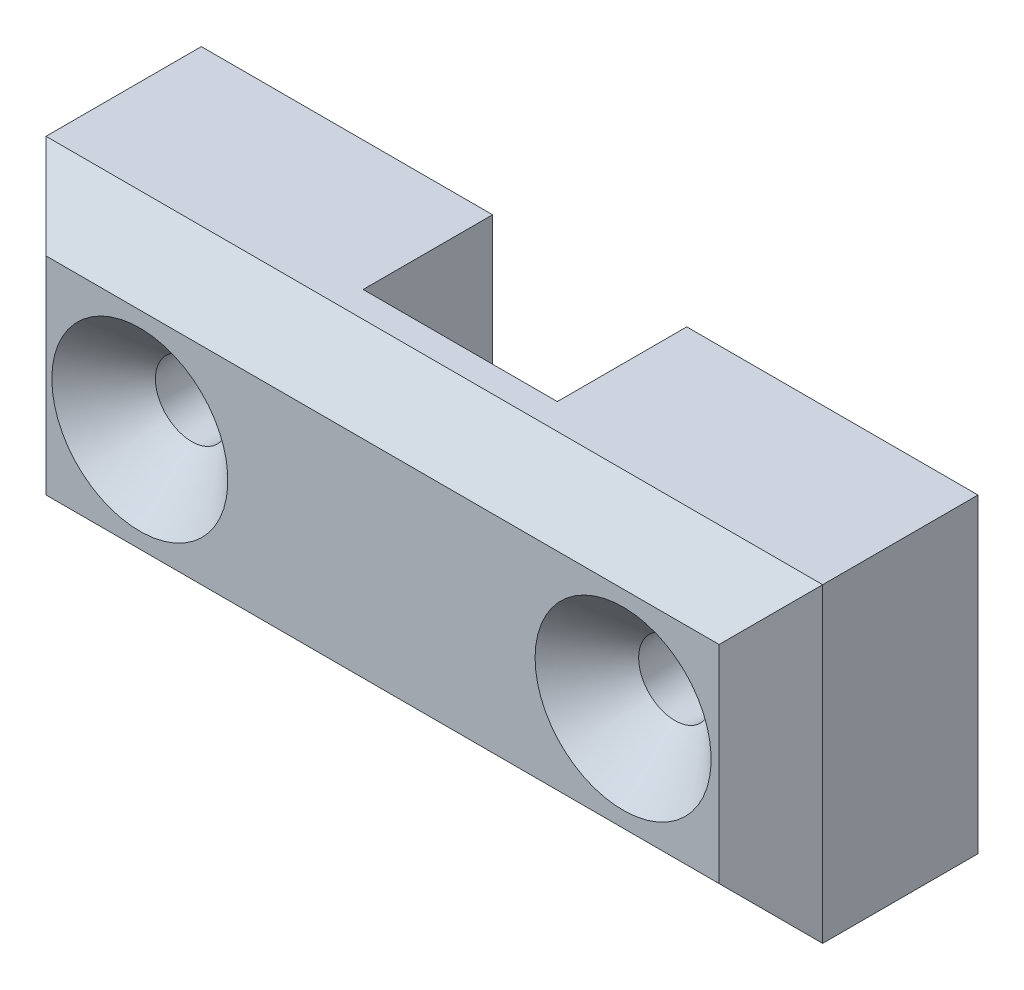
ISO-10303-21;
HEADER;
FILE_DESCRIPTION(('STEP AP214'),'2;1');
FILE_NAME('part.step','',(''),(''),'','','');
FILE_SCHEMA(('AUTOMOTIVE_DESIGN { 1 0 10303 214 1 1 1 1 }'));
ENDSEC;
DATA;
#1=APPLICATION_CONTEXT('core data for automotive mechanical design processes');
#2=APPLICATION_PROTOCOL_DEFINITION('international standard','automotive_design',2000,#1);
#3=PRODUCT_CONTEXT('',#1,'mechanical');
#4=PRODUCT('Part','Part','',(#3));
#5=PRODUCT_RELATED_PRODUCT_CATEGORY('part','',(#4));
#6=PRODUCT_DEFINITION_FORMATION('','',#4);
#7=PRODUCT_DEFINITION_CONTEXT('part definition',#1,'design');
#8=PRODUCT_DEFINITION('design','',#6,#7);
#9=PRODUCT_DEFINITION_SHAPE('','',#8);
#10=(LENGTH_UNIT() NAMED_UNIT(*) SI_UNIT(.MILLI.,.METRE.));
#11=(NAMED_UNIT(*) PLANE_ANGLE_UNIT() SI_UNIT($,.RADIAN.));
#12=(NAMED_UNIT(*) SI_UNIT($,.STERADIAN.) SOLID_ANGLE_UNIT());
#13=UNCERTAINTY_MEASURE_WITH_UNIT(LENGTH_MEASURE(1.E-05),#10,'distance_accuracy_value','');
#14=(GEOMETRIC_REPRESENTATION_CONTEXT(3) GLOBAL_UNCERTAINTY_ASSIGNED_CONTEXT((#13)) GLOBAL_UNIT_ASSIGNED_CONTEXT((#10,
#11,#12)) REPRESENTATION_CONTEXT('',''));
#15=CARTESIAN_POINT('',(0.,0.,0.));
#16=DIRECTION('',(0.,0.,1.));
#17=DIRECTION('',(1.,0.,0.));
#18=AXIS2_PLACEMENT_3D('',#15,#16,#17);
#19=CARTESIAN_POINT('',(0.,0.,60.73181520798));
#20=DIRECTION('',(0.,0.,-1.));
#21=DIRECTION('',(-1.,0.,0.));
#22=AXIS2_PLACEMENT_3D('',#19,#20,#21);
#23=PLANE('',#22);
#24=DIRECTION('',(-1.,0.,0.));
#25=VECTOR('',#24,1.);
#26=CARTESIAN_POINT('',(-3.198147188712,38.101061355301,60.73181520798));
#27=LINE('',#26,#25);
#28=CARTESIAN_POINT('',(-14.448147188712,38.101061355301,60.73181520798));
#29=VERTEX_POINT('',#28);
#30=CARTESIAN_POINT('',(-21.948147188712,38.101061355301,60.73181520798));
#31=VERTEX_POINT('',#30);
#32=EDGE_CURVE('E177',#29,#31,#27,.T.);
#33=ORIENTED_EDGE('',*,*,#32,.T.);
#34=DIRECTION('',(0.,-1.,0.));
#35=VECTOR('',#34,1.);
#36=CARTESIAN_POINT('',(-21.948147188712,50.101061355301,60.73181520798));
#37=LINE('',#36,#35);
#38=CARTESIAN_POINT('',(-21.948147188712,50.101061355301,60.73181520798));
#39=VERTEX_POINT('',#38);
#40=EDGE_CURVE('E157',#39,#31,#37,.T.);
#41=ORIENTED_EDGE('',*,*,#40,.F.);
#42=DIRECTION('',(-1.,0.,0.));
#43=VECTOR('',#42,1.);
#44=CARTESIAN_POINT('',(-3.198147188712,50.101061355301,60.73181520798));
#45=LINE('',#44,#43);
#46=CARTESIAN_POINT('',(-14.448147188712,50.101061355301,60.73181520798));
#47=VERTEX_POINT('',#46);
#48=EDGE_CURVE('E206',#47,#39,#45,.T.);
#49=ORIENTED_EDGE('',*,*,#48,.F.);
#50=DIRECTION('',(0.,1.,0.));
#51=VECTOR('',#50,1.);
#52=CARTESIAN_POINT('',(-14.448147188712,50.101061355301,60.73181520798));
#53=LINE('',#52,#51);
#54=EDGE_CURVE('E161',#29,#47,#53,.T.);
#55=ORIENTED_EDGE('',*,*,#54,.F.);
#56=EDGE_LOOP('',(#33,#41,#49,#55));
#57=FACE_BOUND('',#56,.T.);
#58=ADVANCED_FACE('F53',(#57),#23,.T.);
#59=CARTESIAN_POINT('',(-3.198147188712,50.101061355301,63.73181520798));
#60=DIRECTION('',(1.,0.,0.));
#61=DIRECTION('',(0.,0.,-1.));
#62=AXIS2_PLACEMENT_3D('',#59,#60,#61);
#63=PLANE('',#62);
#64=DIRECTION('',(0.,0.,-1.));
#65=VECTOR('',#64,1.);
#66=CARTESIAN_POINT('',(-3.198147188712,50.101061355301,63.73181520798));
#67=LINE('',#66,#65);
#68=CARTESIAN_POINT('',(-3.198147188712,50.101061355301,61.73181520798));
#69=VERTEX_POINT('',#68);
#70=CARTESIAN_POINT('',(-3.198147188712,50.101061355301,55.73181520798));
#71=VERTEX_POINT('',#70);
#72=EDGE_CURVE('E139',#69,#71,#67,.T.);
#73=ORIENTED_EDGE('',*,*,#72,.F.);
#74=DIRECTION('',(0.,-1.,0.));
#75=VECTOR('',#74,1.);
#76=CARTESIAN_POINT('',(-3.198147188712,38.101061355301,61.73181520798));
#77=LINE('',#76,#75);
#78=CARTESIAN_POINT('',(-3.198147188712,38.101061355301,61.73181520798));
#79=VERTEX_POINT('',#78);
#80=EDGE_CURVE('E245',#69,#79,#77,.T.);
#81=ORIENTED_EDGE('',*,*,#80,.T.);
#82=DIRECTION('',(0.,0.,-1.));
#83=VECTOR('',#82,1.);
#84=CARTESIAN_POINT('',(-3.198147188712,38.101061355301,63.73181520798));
#85=LINE('',#84,#83);
#86=CARTESIAN_POINT('',(-3.198147188712,38.101061355301,55.73181520798));
#87=VERTEX_POINT('',#86);
#88=EDGE_CURVE('E209',#79,#87,#85,.T.);
#89=ORIENTED_EDGE('',*,*,#88,.T.);
#90=DIRECTION('',(0.,-1.,0.));
#91=VECTOR('',#90,1.);
#92=CARTESIAN_POINT('',(-3.198147188712,50.101061355301,55.73181520798));
#93=LINE('',#92,#91);
#94=EDGE_CURVE('E191',#71,#87,#93,.T.);
#95=ORIENTED_EDGE('',*,*,#94,.F.);
#96=EDGE_LOOP('',(#73,#81,#89,#95));
#97=FACE_BOUND('',#96,.T.);
#98=ADVANCED_FACE('F288',(#97),#63,.T.);
#99=CARTESIAN_POINT('',(-3.198147188712,50.101061355301,63.73181520798));
#100=DIRECTION('',(0.,-1.,0.));
#101=DIRECTION('',(0.,0.,-1.));
#102=AXIS2_PLACEMENT_3D('',#99,#100,#101);
#103=PLANE('',#102);
#104=DIRECTION('',(0.,0.,-1.));
#105=VECTOR('',#104,1.);
#106=CARTESIAN_POINT('',(-33.198147188712,50.101061355301,63.73181520798));
#107=LINE('',#106,#105);
#108=CARTESIAN_POINT('',(-33.198147188712,50.101061355301,61.73181520798));
#109=VERTEX_POINT('',#108);
#110=CARTESIAN_POINT('',(-33.198147188712,50.101061355301,55.73181520798));
#111=VERTEX_POINT('',#110);
#112=EDGE_CURVE('E133',#109,#111,#107,.T.);
#113=ORIENTED_EDGE('',*,*,#112,.F.);
#114=DIRECTION('',(1.,0.,0.));
#115=VECTOR('',#114,1.);
#116=CARTESIAN_POINT('',(-3.198147188712,50.101061355301,61.73181520798));
#117=LINE('',#116,#115);
#118=EDGE_CURVE('E72',#109,#69,#117,.T.);
#119=ORIENTED_EDGE('',*,*,#118,.T.);
#120=ORIENTED_EDGE('',*,*,#72,.T.);
#121=DIRECTION('',(1.,0.,0.));
#122=VECTOR('',#121,1.);
#123=CARTESIAN_POINT('',(-3.198147188712,50.101061355301,55.73181520798));
#124=LINE('',#123,#122);
#125=CARTESIAN_POINT('',(-14.448147188712,50.101061355301,55.73181520798));
#126=VERTEX_POINT('',#125);
#127=EDGE_CURVE('E187',#126,#71,#124,.T.);
#128=ORIENTED_EDGE('',*,*,#127,.F.);
#129=DIRECTION('',(0.,0.,1.));
#130=VECTOR('',#129,1.);
#131=CARTESIAN_POINT('',(-14.448147188712,50.101061355301,55.73181520798));
#132=LINE('',#131,#130);
#133=EDGE_CURVE('E182',#126,#47,#132,.T.);
#134=ORIENTED_EDGE('',*,*,#133,.T.);
#135=ORIENTED_EDGE('',*,*,#48,.T.);
#136=DIRECTION('',(0.,0.,1.));
#137=VECTOR('',#136,1.);
#138=CARTESIAN_POINT('',(-21.948147188712,50.101061355301,55.73181520798));
#139=LINE('',#138,#137);
#140=CARTESIAN_POINT('',(-21.948147188712,50.101061355301,55.73181520798));
#141=VERTEX_POINT('',#140);
#142=EDGE_CURVE('E146',#141,#39,#139,.T.);
#143=ORIENTED_EDGE('',*,*,#142,.F.);
#144=DIRECTION('',(1.,0.,0.));
#145=VECTOR('',#144,1.);
#146=CARTESIAN_POINT('',(-33.198147188712,50.101061355301,55.73181520798));
#147=LINE('',#146,#145);
#148=EDGE_CURVE('E143',#111,#141,#147,.T.);
#149=ORIENTED_EDGE('',*,*,#148,.F.);
#150=EDGE_LOOP('',(#113,#119,#120,#128,#134,#135,#143,#149));
#151=FACE_BOUND('',#150,.T.);
#152=ADVANCED_FACE('F144',(#151),#103,.F.);
#153=CARTESIAN_POINT('',(-33.198147188712,50.101061355301,63.73181520798));
#154=DIRECTION('',(1.,0.,0.));
#155=DIRECTION('',(0.,0.,-1.));
#156=AXIS2_PLACEMENT_3D('',#153,#154,#155);
#157=PLANE('',#156);
#158=DIRECTION('',(0.,0.,-1.));
#159=VECTOR('',#158,1.);
#160=CARTESIAN_POINT('',(-33.198147188712,38.101061355301,63.73181520798));
#161=LINE('',#160,#159);
#162=CARTESIAN_POINT('',(-33.198147188712,38.101061355301,61.73181520798));
#163=VERTEX_POINT('',#162);
#164=CARTESIAN_POINT('',(-33.198147188712,38.101061355301,55.73181520798));
#165=VERTEX_POINT('',#164);
#166=EDGE_CURVE('E140',#163,#165,#161,.T.);
#167=ORIENTED_EDGE('',*,*,#166,.F.);
#168=DIRECTION('',(0.,1.,0.));
#169=VECTOR('',#168,1.);
#170=CARTESIAN_POINT('',(-33.198147188712,50.101061355301,61.73181520798));
#171=LINE('',#170,#169);
#172=EDGE_CURVE('E80',#163,#109,#171,.T.);
#173=ORIENTED_EDGE('',*,*,#172,.T.);
#174=ORIENTED_EDGE('',*,*,#112,.T.);
#175=DIRECTION('',(0.,1.,0.));
#176=VECTOR('',#175,1.);
#177=CARTESIAN_POINT('',(-33.198147188712,50.101061355301,55.73181520798));
#178=LINE('',#177,#176);
#179=EDGE_CURVE('E137',#165,#111,#178,.T.);
#180=ORIENTED_EDGE('',*,*,#179,.F.);
#181=EDGE_LOOP('',(#167,#173,#174,#180));
#182=FACE_BOUND('',#181,.T.);
#183=ADVANCED_FACE('F135',(#182),#157,.F.);
#184=CARTESIAN_POINT('',(-3.198147188712,38.101061355301,63.73181520798));
#185=DIRECTION('',(0.,-1.,0.));
#186=DIRECTION('',(0.,0.,-1.));
#187=AXIS2_PLACEMENT_3D('',#184,#185,#186);
#188=PLANE('',#187);
#189=ORIENTED_EDGE('',*,*,#88,.F.);
#190=DIRECTION('',(-1.,0.,0.));
#191=VECTOR('',#190,1.);
#192=CARTESIAN_POINT('',(-33.198147188712,38.101061355301,61.73181520798));
#193=LINE('',#192,#191);
#194=EDGE_CURVE('E211',#79,#163,#193,.T.);
#195=ORIENTED_EDGE('',*,*,#194,.T.);
#196=ORIENTED_EDGE('',*,*,#166,.T.);
#197=DIRECTION('',(-1.,0.,0.));
#198=VECTOR('',#197,1.);
#199=CARTESIAN_POINT('',(-33.198147188712,38.101061355301,55.73181520798));
#200=LINE('',#199,#198);
#201=CARTESIAN_POINT('',(-21.948147188712,38.101061355301,55.73181520798));
#202=VERTEX_POINT('',#201);
#203=EDGE_CURVE('E155',#202,#165,#200,.T.);
#204=ORIENTED_EDGE('',*,*,#203,.F.);
#205=DIRECTION('',(0.,0.,1.));
#206=VECTOR('',#205,1.);
#207=CARTESIAN_POINT('',(-21.948147188712,38.101061355301,55.73181520798));
#208=LINE('',#207,#206);
#209=EDGE_CURVE('E170',#202,#31,#208,.T.);
#210=ORIENTED_EDGE('',*,*,#209,.T.);
#211=ORIENTED_EDGE('',*,*,#32,.F.);
#212=DIRECTION('',(0.,0.,1.));
#213=VECTOR('',#212,1.);
#214=CARTESIAN_POINT('',(-14.448147188712,38.101061355301,55.73181520798));
#215=LINE('',#214,#213);
#216=CARTESIAN_POINT('',(-14.448147188712,38.101061355301,55.73181520798));
#217=VERTEX_POINT('',#216);
#218=EDGE_CURVE('E178',#217,#29,#215,.T.);
#219=ORIENTED_EDGE('',*,*,#218,.F.);
#220=DIRECTION('',(-1.,0.,0.));
#221=VECTOR('',#220,1.);
#222=CARTESIAN_POINT('',(-3.198147188712,38.101061355301,55.73181520798));
#223=LINE('',#222,#221);
#224=EDGE_CURVE('E198',#87,#217,#223,.T.);
#225=ORIENTED_EDGE('',*,*,#224,.F.);
#226=EDGE_LOOP('',(#189,#195,#196,#204,#210,#211,#219,#225));
#227=FACE_BOUND('',#226,.T.);
#228=ADVANCED_FACE('F292',(#227),#188,.T.);
#229=CARTESIAN_POINT('',(0.,0.,63.73181520798));
#230=DIRECTION('',(0.,0.,-1.));
#231=DIRECTION('',(-1.,0.,0.));
#232=AXIS2_PLACEMENT_3D('',#229,#230,#231);
#233=PLANE('',#232);
#234=DIRECTION('',(0.,-1.,0.));
#235=VECTOR('',#234,1.);
#236=CARTESIAN_POINT('',(-31.198147188712,0.,63.73181520798));
#237=LINE('',#236,#235);
#238=CARTESIAN_POINT('',(-31.198147188712,48.101061355301,63.73181520798));
#239=VERTEX_POINT('',#238);
#240=CARTESIAN_POINT('',(-31.198147188712,40.101061355301,63.73181520798));
#241=VERTEX_POINT('',#240);
#242=EDGE_CURVE('E234',#239,#241,#237,.T.);
#243=ORIENTED_EDGE('',*,*,#242,.T.);
#244=DIRECTION('',(1.,0.,0.));
#245=VECTOR('',#244,1.);
#246=CARTESIAN_POINT('',(-3.198147188712,40.101061355301,63.73181520798));
#247=LINE('',#246,#245);
#248=CARTESIAN_POINT('',(-5.198147188712,40.101061355301,63.73181520798));
#249=VERTEX_POINT('',#248);
#250=EDGE_CURVE('E237',#241,#249,#247,.T.);
#251=ORIENTED_EDGE('',*,*,#250,.T.);
#252=DIRECTION('',(0.,1.,0.));
#253=VECTOR('',#252,1.);
#254=CARTESIAN_POINT('',(-5.198147188712,50.101061355301,63.73181520798));
#255=LINE('',#254,#253);
#256=CARTESIAN_POINT('',(-5.198147188712,48.101061355301,63.73181520798));
#257=VERTEX_POINT('',#256);
#258=EDGE_CURVE('E228',#249,#257,#255,.T.);
#259=ORIENTED_EDGE('',*,*,#258,.T.);
#260=DIRECTION('',(-1.,0.,0.));
#261=VECTOR('',#260,1.);
#262=CARTESIAN_POINT('',(0.,48.101061355301,63.73181520798));
#263=LINE('',#262,#261);
#264=EDGE_CURVE('E231',#257,#239,#263,.T.);
#265=ORIENTED_EDGE('',*,*,#264,.T.);
#266=EDGE_LOOP('',(#243,#251,#259,#265));
#267=FACE_BOUND('',#266,.T.);
#268=CARTESIAN_POINT('',(-27.573147188712,44.101061355301,63.73181520798));
#269=DIRECTION('',(0.,0.,-1.));
#270=DIRECTION('',(-1.,0.,0.));
#271=AXIS2_PLACEMENT_3D('',#268,#269,#270);
#272=CIRCLE('',#271,3.4);
#273=CARTESIAN_POINT('',(-30.973147188712,44.101061355301,63.73181520798));
#274=VERTEX_POINT('',#273);
#275=EDGE_CURVE('E224',#274,#274,#272,.T.);
#276=ORIENTED_EDGE('',*,*,#275,.T.);
#277=EDGE_LOOP('',(#276));
#278=FACE_BOUND('',#277,.T.);
#279=CARTESIAN_POINT('',(-8.90678315498321,44.101061355301,63.73181520798));
#280=DIRECTION('',(0.,0.,-1.));
#281=DIRECTION('',(-1.,0.,0.));
#282=AXIS2_PLACEMENT_3D('',#279,#280,#281);
#283=CIRCLE('',#282,3.4);
#284=CARTESIAN_POINT('',(-12.3067831549832,44.101061355301,63.73181520798));
#285=VERTEX_POINT('',#284);
#286=EDGE_CURVE('E220',#285,#285,#283,.T.);
#287=ORIENTED_EDGE('',*,*,#286,.T.);
#288=EDGE_LOOP('',(#287));
#289=FACE_BOUND('',#288,.T.);
#290=ADVANCED_FACE('F330',(#267,#278,#289),#233,.F.);
#291=CARTESIAN_POINT('',(-21.948147188712,50.101061355301,55.73181520798));
#292=DIRECTION('',(-1.,0.,0.));
#293=DIRECTION('',(0.,0.,1.));
#294=AXIS2_PLACEMENT_3D('',#291,#292,#293);
#295=PLANE('',#294);
#296=ORIENTED_EDGE('',*,*,#40,.T.);
#297=ORIENTED_EDGE('',*,*,#209,.F.);
#298=DIRECTION('',(0.,-1.,0.));
#299=VECTOR('',#298,1.);
#300=CARTESIAN_POINT('',(-21.948147188712,50.101061355301,55.73181520798));
#301=LINE('',#300,#299);
#302=EDGE_CURVE('E150',#141,#202,#301,.T.);
#303=ORIENTED_EDGE('',*,*,#302,.F.);
#304=ORIENTED_EDGE('',*,*,#142,.T.);
#305=EDGE_LOOP('',(#296,#297,#303,#304));
#306=FACE_BOUND('',#305,.T.);
#307=ADVANCED_FACE('F301',(#306),#295,.F.);
#308=CARTESIAN_POINT('',(0.,0.,55.73181520798));
#309=DIRECTION('',(0.,0.,1.));
#310=DIRECTION('',(1.,0.,0.));
#311=AXIS2_PLACEMENT_3D('',#308,#309,#310);
#312=PLANE('',#311);
#313=CARTESIAN_POINT('',(-27.573147188712,44.101061355301,55.73181520798));
#314=DIRECTION('',(0.,0.,-1.));
#315=DIRECTION('',(-1.,0.,0.));
#316=AXIS2_PLACEMENT_3D('',#313,#314,#315);
#317=CIRCLE('',#316,1.4);
#318=CARTESIAN_POINT('',(-28.973147188712,44.101061355301,55.73181520798));
#319=VERTEX_POINT('',#318);
#320=EDGE_CURVE('E164',#319,#319,#317,.T.);
#321=ORIENTED_EDGE('',*,*,#320,.F.);
#322=EDGE_LOOP('',(#321));
#323=FACE_BOUND('',#322,.T.);
#324=ORIENTED_EDGE('',*,*,#179,.T.);
#325=ORIENTED_EDGE('',*,*,#148,.T.);
#326=ORIENTED_EDGE('',*,*,#302,.T.);
#327=ORIENTED_EDGE('',*,*,#203,.T.);
#328=EDGE_LOOP('',(#324,#325,#326,#327));
#329=FACE_BOUND('',#328,.T.);
#330=ADVANCED_FACE('F153',(#323,#329),#312,.F.);
#331=CARTESIAN_POINT('',(-14.448147188712,50.101061355301,55.73181520798));
#332=DIRECTION('',(1.,0.,0.));
#333=DIRECTION('',(0.,1.,0.));
#334=AXIS2_PLACEMENT_3D('',#331,#332,#333);
#335=PLANE('',#334);
#336=ORIENTED_EDGE('',*,*,#54,.T.);
#337=ORIENTED_EDGE('',*,*,#133,.F.);
#338=DIRECTION('',(0.,1.,0.));
#339=VECTOR('',#338,1.);
#340=CARTESIAN_POINT('',(-14.448147188712,50.101061355301,55.73181520798));
#341=LINE('',#340,#339);
#342=EDGE_CURVE('E195',#217,#126,#341,.T.);
#343=ORIENTED_EDGE('',*,*,#342,.F.);
#344=ORIENTED_EDGE('',*,*,#218,.T.);
#345=EDGE_LOOP('',(#336,#337,#343,#344));
#346=FACE_BOUND('',#345,.T.);
#347=ADVANCED_FACE('F281',(#346),#335,.F.);
#348=CARTESIAN_POINT('',(0.,0.,55.73181520798));
#349=DIRECTION('',(0.,0.,-1.));
#350=DIRECTION('',(-1.,0.,0.));
#351=AXIS2_PLACEMENT_3D('',#348,#349,#350);
#352=PLANE('',#351);
#353=CARTESIAN_POINT('',(-8.90678315498321,44.101061355301,55.73181520798));
#354=DIRECTION('',(0.,0.,-1.));
#355=DIRECTION('',(-1.,0.,0.));
#356=AXIS2_PLACEMENT_3D('',#353,#354,#355);
#357=CIRCLE('',#356,1.4);
#358=CARTESIAN_POINT('',(-10.3067831549832,44.101061355301,55.73181520798));
#359=VERTEX_POINT('',#358);
#360=EDGE_CURVE('E183',#359,#359,#357,.T.);
#361=ORIENTED_EDGE('',*,*,#360,.F.);
#362=EDGE_LOOP('',(#361));
#363=FACE_BOUND('',#362,.T.);
#364=ORIENTED_EDGE('',*,*,#94,.T.);
#365=ORIENTED_EDGE('',*,*,#224,.T.);
#366=ORIENTED_EDGE('',*,*,#342,.T.);
#367=ORIENTED_EDGE('',*,*,#127,.T.);
#368=EDGE_LOOP('',(#364,#365,#366,#367));
#369=FACE_BOUND('',#368,.T.);
#370=ADVANCED_FACE('F278',(#363,#369),#352,.T.);
#371=CARTESIAN_POINT('',(-8.90678315498321,44.101061355301,65.73181520798));
#372=DIRECTION('',(0.,0.,-1.));
#373=DIRECTION('',(-1.,0.,0.));
#374=AXIS2_PLACEMENT_3D('',#371,#372,#373);
#375=CYLINDRICAL_SURFACE('',#374,1.4);
#376=CARTESIAN_POINT('',(-8.90678315498321,44.101061355301,61.73181520798));
#377=DIRECTION('',(0.,0.,-1.));
#378=DIRECTION('',(-1.,0.,0.));
#379=AXIS2_PLACEMENT_3D('',#376,#377,#378);
#380=CIRCLE('',#379,1.4);
#381=CARTESIAN_POINT('',(-10.3067831549832,44.101061355301,61.73181520798));
#382=VERTEX_POINT('',#381);
#383=EDGE_CURVE('E11',#382,#382,#380,.F.);
#384=ORIENTED_EDGE('',*,*,#383,.T.);
#385=EDGE_LOOP('',(#384));
#386=FACE_BOUND('',#385,.T.);
#387=ORIENTED_EDGE('',*,*,#360,.T.);
#388=EDGE_LOOP('',(#387));
#389=FACE_BOUND('',#388,.T.);
#390=ADVANCED_FACE('F276',(#386,#389),#375,.F.);
#391=CARTESIAN_POINT('',(-27.573147188712,44.101061355301,65.73181520798));
#392=DIRECTION('',(0.,0.,-1.));
#393=DIRECTION('',(-1.,0.,0.));
#394=AXIS2_PLACEMENT_3D('',#391,#392,#393);
#395=CYLINDRICAL_SURFACE('',#394,1.4);
#396=CARTESIAN_POINT('',(-27.573147188712,44.101061355301,61.73181520798));
#397=DIRECTION('',(0.,0.,-1.));
#398=DIRECTION('',(-1.,0.,0.));
#399=AXIS2_PLACEMENT_3D('',#396,#397,#398);
#400=CIRCLE('',#399,1.4);
#401=CARTESIAN_POINT('',(-28.973147188712,44.101061355301,61.73181520798));
#402=VERTEX_POINT('',#401);
#403=EDGE_CURVE('E64',#402,#402,#400,.F.);
#404=ORIENTED_EDGE('',*,*,#403,.T.);
#405=EDGE_LOOP('',(#404));
#406=FACE_BOUND('',#405,.T.);
#407=ORIENTED_EDGE('',*,*,#320,.T.);
#408=EDGE_LOOP('',(#407));
#409=FACE_BOUND('',#408,.T.);
#410=ADVANCED_FACE('F353',(#406,#409),#395,.F.);
#411=CARTESIAN_POINT('',(0.,48.101061355301,63.73181520798));
#412=DIRECTION('',(0.,-0.707106781186544,-0.707106781186551));
#413=DIRECTION('',(-1.,0.,0.));
#414=AXIS2_PLACEMENT_3D('',#411,#412,#413);
#415=PLANE('',#414);
#416=DIRECTION('',(0.577350269189628,-0.577350269189628,0.577350269189622));
#417=VECTOR('',#416,1.);
#418=CARTESIAN_POINT('',(-20.7987647924746,37.7016789590636,74.1311976042173));
#419=LINE('',#418,#417);
#420=EDGE_CURVE('E256',#239,#109,#419,.F.);
#421=ORIENTED_EDGE('',*,*,#420,.F.);
#422=ORIENTED_EDGE('',*,*,#264,.F.);
#423=DIRECTION('',(0.577350269189628,0.577350269189628,-0.577350269189622));
#424=VECTOR('',#423,1.);
#425=CARTESIAN_POINT('',(-3.198147188712,50.101061355301,61.73181520798));
#426=LINE('',#425,#424);
#427=EDGE_CURVE('E58',#69,#257,#426,.F.);
#428=ORIENTED_EDGE('',*,*,#427,.F.);
#429=ORIENTED_EDGE('',*,*,#118,.F.);
#430=EDGE_LOOP('',(#421,#422,#428,#429));
#431=FACE_BOUND('',#430,.T.);
#432=ADVANCED_FACE('F317',(#431),#415,.F.);
#433=CARTESIAN_POINT('',(-3.198147188712,50.101061355301,61.73181520798));
#434=DIRECTION('',(0.707106781186544,0.,0.707106781186551));
#435=DIRECTION('',(0.,1.,0.));
#436=AXIS2_PLACEMENT_3D('',#433,#434,#435);
#437=PLANE('',#436);
#438=ORIENTED_EDGE('',*,*,#427,.T.);
#439=ORIENTED_EDGE('',*,*,#258,.F.);
#440=DIRECTION('',(0.577350269189628,-0.577350269189628,-0.577350269189622));
#441=VECTOR('',#440,1.);
#442=CARTESIAN_POINT('',(-7.19814718871202,42.101061355301,65.73181520798));
#443=LINE('',#442,#441);
#444=EDGE_CURVE('E254',#79,#249,#443,.F.);
#445=ORIENTED_EDGE('',*,*,#444,.F.);
#446=ORIENTED_EDGE('',*,*,#80,.F.);
#447=EDGE_LOOP('',(#438,#439,#445,#446));
#448=FACE_BOUND('',#447,.T.);
#449=ADVANCED_FACE('F309',(#448),#437,.T.);
#450=CARTESIAN_POINT('',(-31.198147188712,0.,63.73181520798));
#451=DIRECTION('',(0.707106781186544,0.,-0.707106781186551));
#452=DIRECTION('',(0.,-1.,0.));
#453=AXIS2_PLACEMENT_3D('',#450,#451,#452);
#454=PLANE('',#453);
#455=ORIENTED_EDGE('',*,*,#420,.T.);
#456=ORIENTED_EDGE('',*,*,#172,.F.);
#457=DIRECTION('',(-0.577350269189628,-0.577350269189628,-0.577350269189622));
#458=VECTOR('',#457,1.);
#459=CARTESIAN_POINT('',(-44.5651676404791,26.7340409035339,50.364794756213));
#460=LINE('',#459,#458);
#461=EDGE_CURVE('E251',#241,#163,#460,.T.);
#462=ORIENTED_EDGE('',*,*,#461,.F.);
#463=ORIENTED_EDGE('',*,*,#242,.F.);
#464=EDGE_LOOP('',(#455,#456,#462,#463));
#465=FACE_BOUND('',#464,.T.);
#466=ADVANCED_FACE('F307',(#465),#454,.F.);
#467=CARTESIAN_POINT('',(-3.198147188712,38.101061355301,61.73181520798));
#468=DIRECTION('',(0.,-0.707106781186544,0.707106781186551));
#469=DIRECTION('',(1.,0.,0.));
#470=AXIS2_PLACEMENT_3D('',#467,#468,#469);
#471=PLANE('',#470);
#472=ORIENTED_EDGE('',*,*,#444,.T.);
#473=ORIENTED_EDGE('',*,*,#250,.F.);
#474=ORIENTED_EDGE('',*,*,#461,.T.);
#475=ORIENTED_EDGE('',*,*,#194,.F.);
#476=EDGE_LOOP('',(#472,#473,#474,#475));
#477=FACE_BOUND('',#476,.T.);
#478=ADVANCED_FACE('F304',(#477),#471,.T.);
#479=CARTESIAN_POINT('',(-27.573147188712,44.101061355301,63.73181520798));
#480=DIRECTION('',(0.,0.,1.));
#481=DIRECTION('',(1.,0.,0.));
#482=AXIS2_PLACEMENT_3D('',#479,#480,#481);
#483=CONICAL_SURFACE('',#482,3.4,0.785398163397447);
#484=ORIENTED_EDGE('',*,*,#403,.F.);
#485=EDGE_LOOP('',(#484));
#486=FACE_BOUND('',#485,.T.);
#487=ORIENTED_EDGE('',*,*,#275,.F.);
#488=EDGE_LOOP('',(#487));
#489=FACE_BOUND('',#488,.T.);
#490=ADVANCED_FACE('F315',(#486,#489),#483,.F.);
#491=CARTESIAN_POINT('',(-8.90678315498321,44.101061355301,63.73181520798));
#492=DIRECTION('',(0.,0.,1.));
#493=DIRECTION('',(1.,0.,0.));
#494=AXIS2_PLACEMENT_3D('',#491,#492,#493);
#495=CONICAL_SURFACE('',#494,3.4,0.785398163397447);
#496=ORIENTED_EDGE('',*,*,#383,.F.);
#497=EDGE_LOOP('',(#496));
#498=FACE_BOUND('',#497,.T.);
#499=ORIENTED_EDGE('',*,*,#286,.F.);
#500=EDGE_LOOP('',(#499));
#501=FACE_BOUND('',#500,.T.);
#502=ADVANCED_FACE('F56',(#498,#501),#495,.F.);
#503=CLOSED_SHELL('',(#58,#98,#152,#183,#228,#290,#307,#330,#347,#370,#390,#410,#432,#449,#466,
#478,#490,#502));
#504=MANIFOLD_SOLID_BREP('B2',#503);
#505=ADVANCED_BREP_SHAPE_REPRESENTATION('',(#18,#504),#14);
#506=SHAPE_DEFINITION_REPRESENTATION(#9,#505);
ENDSEC;
END-ISO-10303-21;
